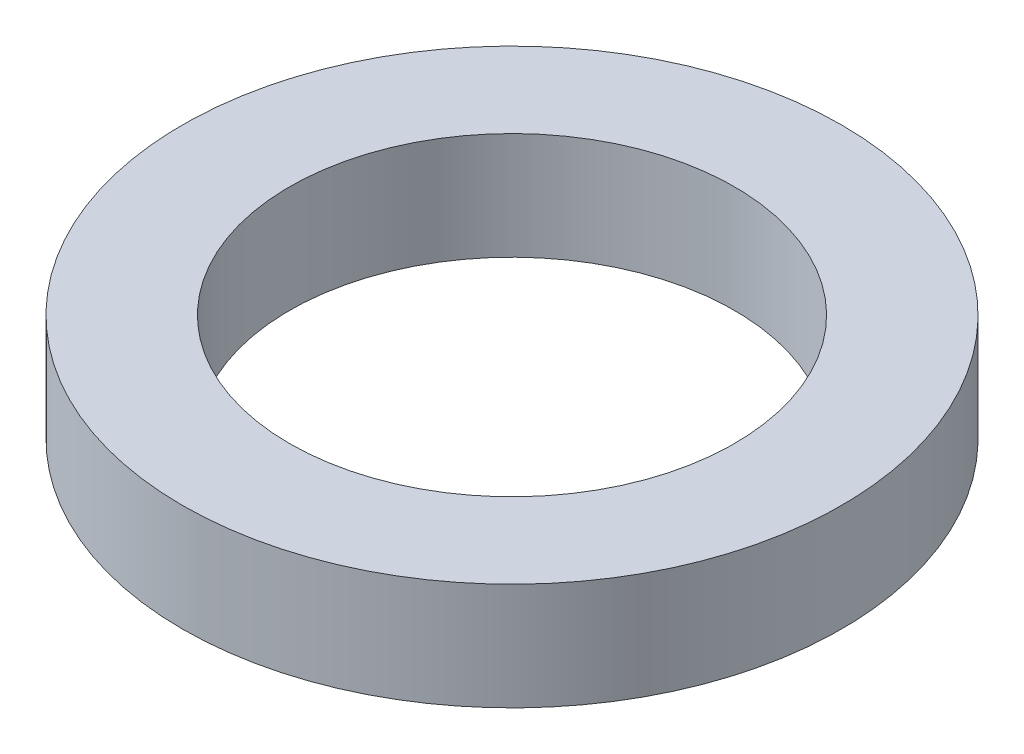
ISO-10303-21;
HEADER;
FILE_DESCRIPTION(('STEP AP214'),'2;1');
FILE_NAME('part.step','',(''),(''),'','','');
FILE_SCHEMA(('AUTOMOTIVE_DESIGN { 1 0 10303 214 1 1 1 1 }'));
ENDSEC;
DATA;
#1=APPLICATION_CONTEXT('core data for automotive mechanical design processes');
#2=APPLICATION_PROTOCOL_DEFINITION('international standard','automotive_design',2000,#1);
#3=PRODUCT_CONTEXT('',#1,'mechanical');
#4=PRODUCT('Part','Part','',(#3));
#5=PRODUCT_RELATED_PRODUCT_CATEGORY('part','',(#4));
#6=PRODUCT_DEFINITION_FORMATION('','',#4);
#7=PRODUCT_DEFINITION_CONTEXT('part definition',#1,'design');
#8=PRODUCT_DEFINITION('design','',#6,#7);
#9=PRODUCT_DEFINITION_SHAPE('','',#8);
#10=(LENGTH_UNIT() NAMED_UNIT(*) SI_UNIT(.MILLI.,.METRE.));
#11=(NAMED_UNIT(*) PLANE_ANGLE_UNIT() SI_UNIT($,.RADIAN.));
#12=(NAMED_UNIT(*) SI_UNIT($,.STERADIAN.) SOLID_ANGLE_UNIT());
#13=UNCERTAINTY_MEASURE_WITH_UNIT(LENGTH_MEASURE(1.E-05),#10,'distance_accuracy_value','');
#14=(GEOMETRIC_REPRESENTATION_CONTEXT(3) GLOBAL_UNCERTAINTY_ASSIGNED_CONTEXT((#13)) GLOBAL_UNIT_ASSIGNED_CONTEXT((#10,
#11,#12)) REPRESENTATION_CONTEXT('',''));
#15=CARTESIAN_POINT('',(0.,0.,0.));
#16=DIRECTION('',(0.,0.,1.));
#17=DIRECTION('',(1.,0.,0.));
#18=AXIS2_PLACEMENT_3D('',#15,#16,#17);
#19=CARTESIAN_POINT('',(0.,1.3,0.));
#20=DIRECTION('',(0.,1.,0.));
#21=DIRECTION('',(0.,0.,1.));
#22=AXIS2_PLACEMENT_3D('',#19,#20,#21);
#23=PLANE('',#22);
#24=CARTESIAN_POINT('',(0.,1.3,0.));
#25=DIRECTION('',(0.,1.,0.));
#26=DIRECTION('',(0.,0.,1.));
#27=AXIS2_PLACEMENT_3D('',#24,#25,#26);
#28=CIRCLE('',#27,4.);
#29=CARTESIAN_POINT('',(0.,1.3,4.));
#30=VERTEX_POINT('',#29);
#31=EDGE_CURVE('E10',#30,#30,#28,.T.);
#32=ORIENTED_EDGE('',*,*,#31,.T.);
#33=EDGE_LOOP('',(#32));
#34=FACE_BOUND('',#33,.T.);
#35=CARTESIAN_POINT('',(0.,1.3,0.));
#36=DIRECTION('',(0.,1.,0.));
#37=DIRECTION('',(0.,0.,1.));
#38=AXIS2_PLACEMENT_3D('',#35,#36,#37);
#39=CIRCLE('',#38,2.7);
#40=CARTESIAN_POINT('',(0.,1.3,2.7));
#41=VERTEX_POINT('',#40);
#42=EDGE_CURVE('E41',#41,#41,#39,.T.);
#43=ORIENTED_EDGE('',*,*,#42,.F.);
#44=EDGE_LOOP('',(#43));
#45=FACE_BOUND('',#44,.T.);
#46=ADVANCED_FACE('F30',(#34,#45),#23,.T.);
#47=CARTESIAN_POINT('',(0.,0.,0.));
#48=DIRECTION('',(0.,1.,0.));
#49=DIRECTION('',(0.,0.,1.));
#50=AXIS2_PLACEMENT_3D('',#47,#48,#49);
#51=PLANE('',#50);
#52=CARTESIAN_POINT('',(0.,0.,0.));
#53=DIRECTION('',(0.,1.,0.));
#54=DIRECTION('',(0.,0.,1.));
#55=AXIS2_PLACEMENT_3D('',#52,#53,#54);
#56=CIRCLE('',#55,4.);
#57=CARTESIAN_POINT('',(0.,0.,4.));
#58=VERTEX_POINT('',#57);
#59=EDGE_CURVE('E34',#58,#58,#56,.T.);
#60=ORIENTED_EDGE('',*,*,#59,.F.);
#61=EDGE_LOOP('',(#60));
#62=FACE_BOUND('',#61,.T.);
#63=CARTESIAN_POINT('',(0.,0.,0.));
#64=DIRECTION('',(0.,1.,0.));
#65=DIRECTION('',(0.,0.,1.));
#66=AXIS2_PLACEMENT_3D('',#63,#64,#65);
#67=CIRCLE('',#66,2.7);
#68=CARTESIAN_POINT('',(0.,0.,2.7));
#69=VERTEX_POINT('',#68);
#70=EDGE_CURVE('E43',#69,#69,#67,.T.);
#71=ORIENTED_EDGE('',*,*,#70,.T.);
#72=EDGE_LOOP('',(#71));
#73=FACE_BOUND('',#72,.T.);
#74=ADVANCED_FACE('F53',(#62,#73),#51,.F.);
#75=CARTESIAN_POINT('',(0.,1.3,0.));
#76=DIRECTION('',(0.,-1.,0.));
#77=DIRECTION('',(0.,0.,-1.));
#78=AXIS2_PLACEMENT_3D('',#75,#76,#77);
#79=CYLINDRICAL_SURFACE('',#78,4.);
#80=ORIENTED_EDGE('',*,*,#31,.F.);
#81=EDGE_LOOP('',(#80));
#82=FACE_BOUND('',#81,.T.);
#83=ORIENTED_EDGE('',*,*,#59,.T.);
#84=EDGE_LOOP('',(#83));
#85=FACE_BOUND('',#84,.T.);
#86=ADVANCED_FACE('F32',(#82,#85),#79,.T.);
#87=CARTESIAN_POINT('',(0.,1.3,0.));
#88=DIRECTION('',(0.,-1.,0.));
#89=DIRECTION('',(0.,0.,-1.));
#90=AXIS2_PLACEMENT_3D('',#87,#88,#89);
#91=CYLINDRICAL_SURFACE('',#90,2.7);
#92=ORIENTED_EDGE('',*,*,#42,.T.);
#93=EDGE_LOOP('',(#92));
#94=FACE_BOUND('',#93,.T.);
#95=ORIENTED_EDGE('',*,*,#70,.F.);
#96=EDGE_LOOP('',(#95));
#97=FACE_BOUND('',#96,.T.);
#98=ADVANCED_FACE('F49',(#94,#97),#91,.F.);
#99=CLOSED_SHELL('',(#46,#74,#86,#98));
#100=MANIFOLD_SOLID_BREP('B2',#99);
#101=ADVANCED_BREP_SHAPE_REPRESENTATION('',(#18,#100),#14);
#102=SHAPE_DEFINITION_REPRESENTATION(#9,#101);
ENDSEC;
END-ISO-10303-21;
